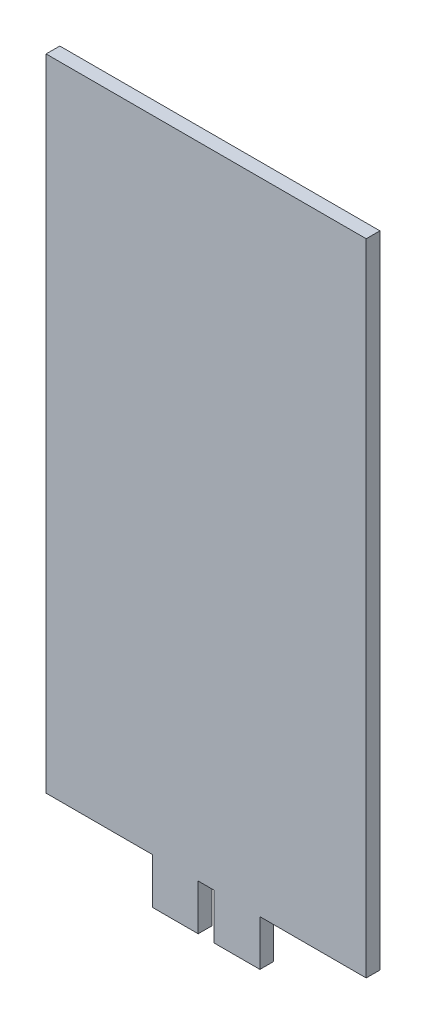
ISO-10303-21;
HEADER;
FILE_DESCRIPTION(('STEP AP214'),'2;1');
FILE_NAME('part.step','',(''),(''),'','','');
FILE_SCHEMA(('AUTOMOTIVE_DESIGN { 1 0 10303 214 1 1 1 1 }'));
ENDSEC;
DATA;
#1=APPLICATION_CONTEXT('core data for automotive mechanical design processes');
#2=APPLICATION_PROTOCOL_DEFINITION('international standard','automotive_design',2000,#1);
#3=PRODUCT_CONTEXT('',#1,'mechanical');
#4=PRODUCT('Part','Part','',(#3));
#5=PRODUCT_RELATED_PRODUCT_CATEGORY('part','',(#4));
#6=PRODUCT_DEFINITION_FORMATION('','',#4);
#7=PRODUCT_DEFINITION_CONTEXT('part definition',#1,'design');
#8=PRODUCT_DEFINITION('design','',#6,#7);
#9=PRODUCT_DEFINITION_SHAPE('','',#8);
#10=(LENGTH_UNIT() NAMED_UNIT(*) SI_UNIT(.MILLI.,.METRE.));
#11=(NAMED_UNIT(*) PLANE_ANGLE_UNIT() SI_UNIT($,.RADIAN.));
#12=(NAMED_UNIT(*) SI_UNIT($,.STERADIAN.) SOLID_ANGLE_UNIT());
#13=UNCERTAINTY_MEASURE_WITH_UNIT(LENGTH_MEASURE(1.E-05),#10,'distance_accuracy_value','');
#14=(GEOMETRIC_REPRESENTATION_CONTEXT(3) GLOBAL_UNCERTAINTY_ASSIGNED_CONTEXT((#13)) GLOBAL_UNIT_ASSIGNED_CONTEXT((#10,
#11,#12)) REPRESENTATION_CONTEXT('',''));
#15=CARTESIAN_POINT('',(0.,0.,0.));
#16=DIRECTION('',(0.,0.,1.));
#17=DIRECTION('',(1.,0.,0.));
#18=AXIS2_PLACEMENT_3D('',#15,#16,#17);
#19=CARTESIAN_POINT('',(0.,0.,1.5));
#20=DIRECTION('',(0.,1.,0.));
#21=DIRECTION('',(0.,0.,1.));
#22=AXIS2_PLACEMENT_3D('',#19,#20,#21);
#23=PLANE('',#22);
#24=DIRECTION('',(1.,0.,0.));
#25=VECTOR('',#24,1.);
#26=CARTESIAN_POINT('',(0.,0.,1.5));
#27=LINE('',#26,#25);
#28=CARTESIAN_POINT('',(11.63,0.,1.5));
#29=VERTEX_POINT('',#28);
#30=CARTESIAN_POINT('',(16.63,0.,1.5));
#31=VERTEX_POINT('',#30);
#32=EDGE_CURVE('E148',#29,#31,#27,.T.);
#33=ORIENTED_EDGE('',*,*,#32,.F.);
#34=DIRECTION('',(0.,0.,1.));
#35=VECTOR('',#34,1.);
#36=CARTESIAN_POINT('',(11.63,0.,0.));
#37=LINE('',#36,#35);
#38=CARTESIAN_POINT('',(11.63,0.,0.));
#39=VERTEX_POINT('',#38);
#40=EDGE_CURVE('E134',#39,#29,#37,.T.);
#41=ORIENTED_EDGE('',*,*,#40,.F.);
#42=DIRECTION('',(1.,0.,0.));
#43=VECTOR('',#42,1.);
#44=CARTESIAN_POINT('',(0.,0.,0.));
#45=LINE('',#44,#43);
#46=CARTESIAN_POINT('',(16.63,0.,0.));
#47=VERTEX_POINT('',#46);
#48=EDGE_CURVE('E146',#39,#47,#45,.T.);
#49=ORIENTED_EDGE('',*,*,#48,.T.);
#50=DIRECTION('',(0.,0.,1.));
#51=VECTOR('',#50,1.);
#52=CARTESIAN_POINT('',(16.63,0.,0.));
#53=LINE('',#52,#51);
#54=EDGE_CURVE('E193',#47,#31,#53,.T.);
#55=ORIENTED_EDGE('',*,*,#54,.T.);
#56=EDGE_LOOP('',(#33,#41,#49,#55));
#57=FACE_BOUND('',#56,.T.);
#58=ADVANCED_FACE('F41',(#57),#23,.F.);
#59=CARTESIAN_POINT('',(0.,0.,1.5));
#60=DIRECTION('',(1.,0.,0.));
#61=DIRECTION('',(0.,1.,0.));
#62=AXIS2_PLACEMENT_3D('',#59,#60,#61);
#63=PLANE('',#62);
#64=DIRECTION('',(0.,-1.,0.));
#65=VECTOR('',#64,1.);
#66=CARTESIAN_POINT('',(0.,0.,0.));
#67=LINE('',#66,#65);
#68=CARTESIAN_POINT('',(0.,75.,0.));
#69=VERTEX_POINT('',#68);
#70=CARTESIAN_POINT('',(0.,5.,0.));
#71=VERTEX_POINT('',#70);
#72=EDGE_CURVE('E165',#69,#71,#67,.T.);
#73=ORIENTED_EDGE('',*,*,#72,.T.);
#74=DIRECTION('',(0.,0.,1.));
#75=VECTOR('',#74,1.);
#76=CARTESIAN_POINT('',(0.,5.,0.));
#77=LINE('',#76,#75);
#78=CARTESIAN_POINT('',(0.,5.,1.5));
#79=VERTEX_POINT('',#78);
#80=EDGE_CURVE('E251',#71,#79,#77,.T.);
#81=ORIENTED_EDGE('',*,*,#80,.T.);
#82=DIRECTION('',(0.,-1.,0.));
#83=VECTOR('',#82,1.);
#84=CARTESIAN_POINT('',(0.,0.,1.5));
#85=LINE('',#84,#83);
#86=CARTESIAN_POINT('',(0.,75.,1.5));
#87=VERTEX_POINT('',#86);
#88=EDGE_CURVE('E170',#87,#79,#85,.T.);
#89=ORIENTED_EDGE('',*,*,#88,.F.);
#90=DIRECTION('',(0.,0.,-1.));
#91=VECTOR('',#90,1.);
#92=CARTESIAN_POINT('',(0.,75.,1.5));
#93=LINE('',#92,#91);
#94=EDGE_CURVE('E50',#87,#69,#93,.T.);
#95=ORIENTED_EDGE('',*,*,#94,.T.);
#96=EDGE_LOOP('',(#73,#81,#89,#95));
#97=FACE_BOUND('',#96,.T.);
#98=ADVANCED_FACE('F43',(#97),#63,.F.);
#99=CARTESIAN_POINT('',(18.38,0.,0.));
#100=VERTEX_POINT('',#99);
#101=CARTESIAN_POINT('',(23.38,0.,0.));
#102=VERTEX_POINT('',#101);
#103=EDGE_CURVE('E158',#100,#102,#45,.T.);
#104=ORIENTED_EDGE('',*,*,#103,.T.);
#105=DIRECTION('',(0.,0.,1.));
#106=VECTOR('',#105,1.);
#107=CARTESIAN_POINT('',(23.38,0.,0.));
#108=LINE('',#107,#106);
#109=CARTESIAN_POINT('',(23.38,0.,1.5));
#110=VERTEX_POINT('',#109);
#111=EDGE_CURVE('E226',#102,#110,#108,.T.);
#112=ORIENTED_EDGE('',*,*,#111,.T.);
#113=CARTESIAN_POINT('',(18.38,0.,1.5));
#114=VERTEX_POINT('',#113);
#115=EDGE_CURVE('E187',#114,#110,#27,.T.);
#116=ORIENTED_EDGE('',*,*,#115,.F.);
#117=DIRECTION('',(0.,0.,1.));
#118=VECTOR('',#117,1.);
#119=CARTESIAN_POINT('',(18.38,0.,0.));
#120=LINE('',#119,#118);
#121=EDGE_CURVE('E196',#100,#114,#120,.T.);
#122=ORIENTED_EDGE('',*,*,#121,.F.);
#123=EDGE_LOOP('',(#104,#112,#116,#122));
#124=FACE_BOUND('',#123,.T.);
#125=ADVANCED_FACE('F277',(#124),#23,.F.);
#126=CARTESIAN_POINT('',(35.,0.,1.5));
#127=DIRECTION('',(-1.,0.,0.));
#128=DIRECTION('',(0.,-1.,0.));
#129=AXIS2_PLACEMENT_3D('',#126,#127,#128);
#130=PLANE('',#129);
#131=DIRECTION('',(0.,1.,0.));
#132=VECTOR('',#131,1.);
#133=CARTESIAN_POINT('',(35.,0.,1.5));
#134=LINE('',#133,#132);
#135=CARTESIAN_POINT('',(35.,5.,1.5));
#136=VERTEX_POINT('',#135);
#137=CARTESIAN_POINT('',(35.,75.,1.5));
#138=VERTEX_POINT('',#137);
#139=EDGE_CURVE('E180',#136,#138,#134,.T.);
#140=ORIENTED_EDGE('',*,*,#139,.F.);
#141=DIRECTION('',(0.,0.,1.));
#142=VECTOR('',#141,1.);
#143=CARTESIAN_POINT('',(35.,5.,0.));
#144=LINE('',#143,#142);
#145=CARTESIAN_POINT('',(35.,5.,0.));
#146=VERTEX_POINT('',#145);
#147=EDGE_CURVE('E230',#146,#136,#144,.T.);
#148=ORIENTED_EDGE('',*,*,#147,.F.);
#149=DIRECTION('',(0.,1.,0.));
#150=VECTOR('',#149,1.);
#151=CARTESIAN_POINT('',(35.,0.,0.));
#152=LINE('',#151,#150);
#153=CARTESIAN_POINT('',(35.,75.,0.));
#154=VERTEX_POINT('',#153);
#155=EDGE_CURVE('E157',#146,#154,#152,.T.);
#156=ORIENTED_EDGE('',*,*,#155,.T.);
#157=DIRECTION('',(0.,0.,-1.));
#158=VECTOR('',#157,1.);
#159=CARTESIAN_POINT('',(35.,75.,1.5));
#160=LINE('',#159,#158);
#161=EDGE_CURVE('E11',#138,#154,#160,.T.);
#162=ORIENTED_EDGE('',*,*,#161,.F.);
#163=EDGE_LOOP('',(#140,#148,#156,#162));
#164=FACE_BOUND('',#163,.T.);
#165=ADVANCED_FACE('F283',(#164),#130,.F.);
#166=CARTESIAN_POINT('',(0.,75.,1.5));
#167=DIRECTION('',(0.,-1.,0.));
#168=DIRECTION('',(0.,0.,-1.));
#169=AXIS2_PLACEMENT_3D('',#166,#167,#168);
#170=PLANE('',#169);
#171=DIRECTION('',(-1.,0.,0.));
#172=VECTOR('',#171,1.);
#173=CARTESIAN_POINT('',(0.,75.,0.));
#174=LINE('',#173,#172);
#175=EDGE_CURVE('E162',#154,#69,#174,.T.);
#176=ORIENTED_EDGE('',*,*,#175,.T.);
#177=ORIENTED_EDGE('',*,*,#94,.F.);
#178=DIRECTION('',(-1.,0.,0.));
#179=VECTOR('',#178,1.);
#180=CARTESIAN_POINT('',(0.,75.,1.5));
#181=LINE('',#180,#179);
#182=EDGE_CURVE('E173',#138,#87,#181,.T.);
#183=ORIENTED_EDGE('',*,*,#182,.F.);
#184=ORIENTED_EDGE('',*,*,#161,.T.);
#185=EDGE_LOOP('',(#176,#177,#183,#184));
#186=FACE_BOUND('',#185,.T.);
#187=ADVANCED_FACE('F288',(#186),#170,.F.);
#188=CARTESIAN_POINT('',(0.,0.,1.5));
#189=DIRECTION('',(0.,0.,-1.));
#190=DIRECTION('',(-1.,0.,0.));
#191=AXIS2_PLACEMENT_3D('',#188,#189,#190);
#192=PLANE('',#191);
#193=ORIENTED_EDGE('',*,*,#88,.T.);
#194=DIRECTION('',(-1.,0.,0.));
#195=VECTOR('',#194,1.);
#196=CARTESIAN_POINT('',(0.,5.,1.5));
#197=LINE('',#196,#195);
#198=CARTESIAN_POINT('',(11.63,5.,1.5));
#199=VERTEX_POINT('',#198);
#200=EDGE_CURVE('E140',#199,#79,#197,.T.);
#201=ORIENTED_EDGE('',*,*,#200,.F.);
#202=DIRECTION('',(0.,1.,0.));
#203=VECTOR('',#202,1.);
#204=CARTESIAN_POINT('',(11.63,0.,1.5));
#205=LINE('',#204,#203);
#206=EDGE_CURVE('E237',#29,#199,#205,.T.);
#207=ORIENTED_EDGE('',*,*,#206,.F.);
#208=ORIENTED_EDGE('',*,*,#32,.T.);
#209=DIRECTION('',(0.,-1.,0.));
#210=VECTOR('',#209,1.);
#211=CARTESIAN_POINT('',(16.63,0.,1.5));
#212=LINE('',#211,#210);
#213=CARTESIAN_POINT('',(16.63,5.,1.5));
#214=VERTEX_POINT('',#213);
#215=EDGE_CURVE('E215',#214,#31,#212,.T.);
#216=ORIENTED_EDGE('',*,*,#215,.F.);
#217=DIRECTION('',(-1.,0.,0.));
#218=VECTOR('',#217,1.);
#219=CARTESIAN_POINT('',(16.63,5.,1.5));
#220=LINE('',#219,#218);
#221=CARTESIAN_POINT('',(18.38,5.,1.5));
#222=VERTEX_POINT('',#221);
#223=EDGE_CURVE('E207',#222,#214,#220,.T.);
#224=ORIENTED_EDGE('',*,*,#223,.F.);
#225=DIRECTION('',(0.,1.,0.));
#226=VECTOR('',#225,1.);
#227=CARTESIAN_POINT('',(18.38,0.,1.5));
#228=LINE('',#227,#226);
#229=EDGE_CURVE('E211',#114,#222,#228,.T.);
#230=ORIENTED_EDGE('',*,*,#229,.F.);
#231=ORIENTED_EDGE('',*,*,#115,.T.);
#232=DIRECTION('',(0.,-1.,0.));
#233=VECTOR('',#232,1.);
#234=CARTESIAN_POINT('',(23.38,5.,1.5));
#235=LINE('',#234,#233);
#236=CARTESIAN_POINT('',(23.38,5.,1.5));
#237=VERTEX_POINT('',#236);
#238=EDGE_CURVE('E206',#237,#110,#235,.T.);
#239=ORIENTED_EDGE('',*,*,#238,.F.);
#240=DIRECTION('',(-1.,0.,0.));
#241=VECTOR('',#240,1.);
#242=CARTESIAN_POINT('',(23.38,5.,1.5));
#243=LINE('',#242,#241);
#244=EDGE_CURVE('E238',#136,#237,#243,.T.);
#245=ORIENTED_EDGE('',*,*,#244,.F.);
#246=ORIENTED_EDGE('',*,*,#139,.T.);
#247=ORIENTED_EDGE('',*,*,#182,.T.);
#248=EDGE_LOOP('',(#193,#201,#207,#208,#216,#224,#230,#231,#239,#245,#246,#247));
#249=FACE_BOUND('',#248,.T.);
#250=ADVANCED_FACE('F263',(#249),#192,.F.);
#251=CARTESIAN_POINT('',(0.,0.,0.));
#252=DIRECTION('',(0.,0.,-1.));
#253=DIRECTION('',(-1.,0.,0.));
#254=AXIS2_PLACEMENT_3D('',#251,#252,#253);
#255=PLANE('',#254);
#256=DIRECTION('',(-1.,0.,0.));
#257=VECTOR('',#256,1.);
#258=CARTESIAN_POINT('',(0.,5.,0.));
#259=LINE('',#258,#257);
#260=CARTESIAN_POINT('',(11.63,5.,0.));
#261=VERTEX_POINT('',#260);
#262=EDGE_CURVE('E57',#261,#71,#259,.T.);
#263=ORIENTED_EDGE('',*,*,#262,.T.);
#264=ORIENTED_EDGE('',*,*,#72,.F.);
#265=ORIENTED_EDGE('',*,*,#175,.F.);
#266=ORIENTED_EDGE('',*,*,#155,.F.);
#267=DIRECTION('',(-1.,0.,0.));
#268=VECTOR('',#267,1.);
#269=CARTESIAN_POINT('',(23.38,5.,0.));
#270=LINE('',#269,#268);
#271=CARTESIAN_POINT('',(23.38,5.,0.));
#272=VERTEX_POINT('',#271);
#273=EDGE_CURVE('E231',#146,#272,#270,.T.);
#274=ORIENTED_EDGE('',*,*,#273,.T.);
#275=DIRECTION('',(0.,-1.,0.));
#276=VECTOR('',#275,1.);
#277=CARTESIAN_POINT('',(23.38,5.,0.));
#278=LINE('',#277,#276);
#279=EDGE_CURVE('E65',#272,#102,#278,.T.);
#280=ORIENTED_EDGE('',*,*,#279,.T.);
#281=ORIENTED_EDGE('',*,*,#103,.F.);
#282=DIRECTION('',(0.,1.,0.));
#283=VECTOR('',#282,1.);
#284=CARTESIAN_POINT('',(18.38,0.,0.));
#285=LINE('',#284,#283);
#286=CARTESIAN_POINT('',(18.38,5.,0.));
#287=VERTEX_POINT('',#286);
#288=EDGE_CURVE('E220',#100,#287,#285,.T.);
#289=ORIENTED_EDGE('',*,*,#288,.T.);
#290=DIRECTION('',(-1.,0.,0.));
#291=VECTOR('',#290,1.);
#292=CARTESIAN_POINT('',(16.63,5.,0.));
#293=LINE('',#292,#291);
#294=CARTESIAN_POINT('',(16.63,5.,0.));
#295=VERTEX_POINT('',#294);
#296=EDGE_CURVE('E197',#287,#295,#293,.T.);
#297=ORIENTED_EDGE('',*,*,#296,.T.);
#298=DIRECTION('',(0.,-1.,0.));
#299=VECTOR('',#298,1.);
#300=CARTESIAN_POINT('',(16.63,0.,0.));
#301=LINE('',#300,#299);
#302=EDGE_CURVE('E155',#295,#47,#301,.T.);
#303=ORIENTED_EDGE('',*,*,#302,.T.);
#304=ORIENTED_EDGE('',*,*,#48,.F.);
#305=DIRECTION('',(0.,1.,0.));
#306=VECTOR('',#305,1.);
#307=CARTESIAN_POINT('',(11.63,0.,0.));
#308=LINE('',#307,#306);
#309=EDGE_CURVE('E130',#39,#261,#308,.T.);
#310=ORIENTED_EDGE('',*,*,#309,.T.);
#311=EDGE_LOOP('',(#263,#264,#265,#266,#274,#280,#281,#289,#297,#303,#304,#310));
#312=FACE_BOUND('',#311,.T.);
#313=ADVANCED_FACE('F152',(#312),#255,.T.);
#314=CARTESIAN_POINT('',(16.63,0.,0.));
#315=DIRECTION('',(-1.,0.,0.));
#316=DIRECTION('',(0.,0.,1.));
#317=AXIS2_PLACEMENT_3D('',#314,#315,#316);
#318=PLANE('',#317);
#319=ORIENTED_EDGE('',*,*,#215,.T.);
#320=ORIENTED_EDGE('',*,*,#54,.F.);
#321=ORIENTED_EDGE('',*,*,#302,.F.);
#322=DIRECTION('',(0.,0.,1.));
#323=VECTOR('',#322,1.);
#324=CARTESIAN_POINT('',(16.63,5.,0.));
#325=LINE('',#324,#323);
#326=EDGE_CURVE('E203',#295,#214,#325,.T.);
#327=ORIENTED_EDGE('',*,*,#326,.T.);
#328=EDGE_LOOP('',(#319,#320,#321,#327));
#329=FACE_BOUND('',#328,.T.);
#330=ADVANCED_FACE('F311',(#329),#318,.F.);
#331=CARTESIAN_POINT('',(16.63,5.,0.));
#332=DIRECTION('',(0.,1.,0.));
#333=DIRECTION('',(0.,0.,1.));
#334=AXIS2_PLACEMENT_3D('',#331,#332,#333);
#335=PLANE('',#334);
#336=ORIENTED_EDGE('',*,*,#223,.T.);
#337=ORIENTED_EDGE('',*,*,#326,.F.);
#338=ORIENTED_EDGE('',*,*,#296,.F.);
#339=DIRECTION('',(0.,0.,1.));
#340=VECTOR('',#339,1.);
#341=CARTESIAN_POINT('',(18.38,5.,0.));
#342=LINE('',#341,#340);
#343=EDGE_CURVE('E200',#287,#222,#342,.T.);
#344=ORIENTED_EDGE('',*,*,#343,.T.);
#345=EDGE_LOOP('',(#336,#337,#338,#344));
#346=FACE_BOUND('',#345,.T.);
#347=ADVANCED_FACE('F306',(#346),#335,.F.);
#348=CARTESIAN_POINT('',(18.38,0.,0.));
#349=DIRECTION('',(1.,0.,0.));
#350=DIRECTION('',(0.,0.,-1.));
#351=AXIS2_PLACEMENT_3D('',#348,#349,#350);
#352=PLANE('',#351);
#353=ORIENTED_EDGE('',*,*,#229,.T.);
#354=ORIENTED_EDGE('',*,*,#343,.F.);
#355=ORIENTED_EDGE('',*,*,#288,.F.);
#356=ORIENTED_EDGE('',*,*,#121,.T.);
#357=EDGE_LOOP('',(#353,#354,#355,#356));
#358=FACE_BOUND('',#357,.T.);
#359=ADVANCED_FACE('F301',(#358),#352,.F.);
#360=CARTESIAN_POINT('',(23.38,5.,0.));
#361=DIRECTION('',(-1.,0.,0.));
#362=DIRECTION('',(0.,0.,1.));
#363=AXIS2_PLACEMENT_3D('',#360,#361,#362);
#364=PLANE('',#363);
#365=ORIENTED_EDGE('',*,*,#238,.T.);
#366=ORIENTED_EDGE('',*,*,#111,.F.);
#367=ORIENTED_EDGE('',*,*,#279,.F.);
#368=DIRECTION('',(0.,0.,1.));
#369=VECTOR('',#368,1.);
#370=CARTESIAN_POINT('',(23.38,5.,0.));
#371=LINE('',#370,#369);
#372=EDGE_CURVE('E234',#272,#237,#371,.T.);
#373=ORIENTED_EDGE('',*,*,#372,.T.);
#374=EDGE_LOOP('',(#365,#366,#367,#373));
#375=FACE_BOUND('',#374,.T.);
#376=ADVANCED_FACE('F273',(#375),#364,.F.);
#377=CARTESIAN_POINT('',(23.38,5.,0.));
#378=DIRECTION('',(0.,1.,0.));
#379=DIRECTION('',(0.,0.,1.));
#380=AXIS2_PLACEMENT_3D('',#377,#378,#379);
#381=PLANE('',#380);
#382=ORIENTED_EDGE('',*,*,#244,.T.);
#383=ORIENTED_EDGE('',*,*,#372,.F.);
#384=ORIENTED_EDGE('',*,*,#273,.F.);
#385=ORIENTED_EDGE('',*,*,#147,.T.);
#386=EDGE_LOOP('',(#382,#383,#384,#385));
#387=FACE_BOUND('',#386,.T.);
#388=ADVANCED_FACE('F266',(#387),#381,.F.);
#389=CARTESIAN_POINT('',(0.,5.,0.));
#390=DIRECTION('',(0.,1.,0.));
#391=DIRECTION('',(0.,0.,1.));
#392=AXIS2_PLACEMENT_3D('',#389,#390,#391);
#393=PLANE('',#392);
#394=ORIENTED_EDGE('',*,*,#200,.T.);
#395=ORIENTED_EDGE('',*,*,#80,.F.);
#396=ORIENTED_EDGE('',*,*,#262,.F.);
#397=DIRECTION('',(0.,0.,1.));
#398=VECTOR('',#397,1.);
#399=CARTESIAN_POINT('',(11.63,5.,0.));
#400=LINE('',#399,#398);
#401=EDGE_CURVE('E136',#261,#199,#400,.T.);
#402=ORIENTED_EDGE('',*,*,#401,.T.);
#403=EDGE_LOOP('',(#394,#395,#396,#402));
#404=FACE_BOUND('',#403,.T.);
#405=ADVANCED_FACE('F264',(#404),#393,.F.);
#406=CARTESIAN_POINT('',(11.63,0.,0.));
#407=DIRECTION('',(1.,0.,0.));
#408=DIRECTION('',(0.,1.,0.));
#409=AXIS2_PLACEMENT_3D('',#406,#407,#408);
#410=PLANE('',#409);
#411=ORIENTED_EDGE('',*,*,#206,.T.);
#412=ORIENTED_EDGE('',*,*,#401,.F.);
#413=ORIENTED_EDGE('',*,*,#309,.F.);
#414=ORIENTED_EDGE('',*,*,#40,.T.);
#415=EDGE_LOOP('',(#411,#412,#413,#414));
#416=FACE_BOUND('',#415,.T.);
#417=ADVANCED_FACE('F133',(#416),#410,.F.);
#418=CLOSED_SHELL('',(#58,#98,#125,#165,#187,#250,#313,#330,#347,#359,#376,#388,#405,#417));
#419=MANIFOLD_SOLID_BREP('B2',#418);
#420=ADVANCED_BREP_SHAPE_REPRESENTATION('',(#18,#419),#14);
#421=SHAPE_DEFINITION_REPRESENTATION(#9,#420);
ENDSEC;
END-ISO-10303-21;
